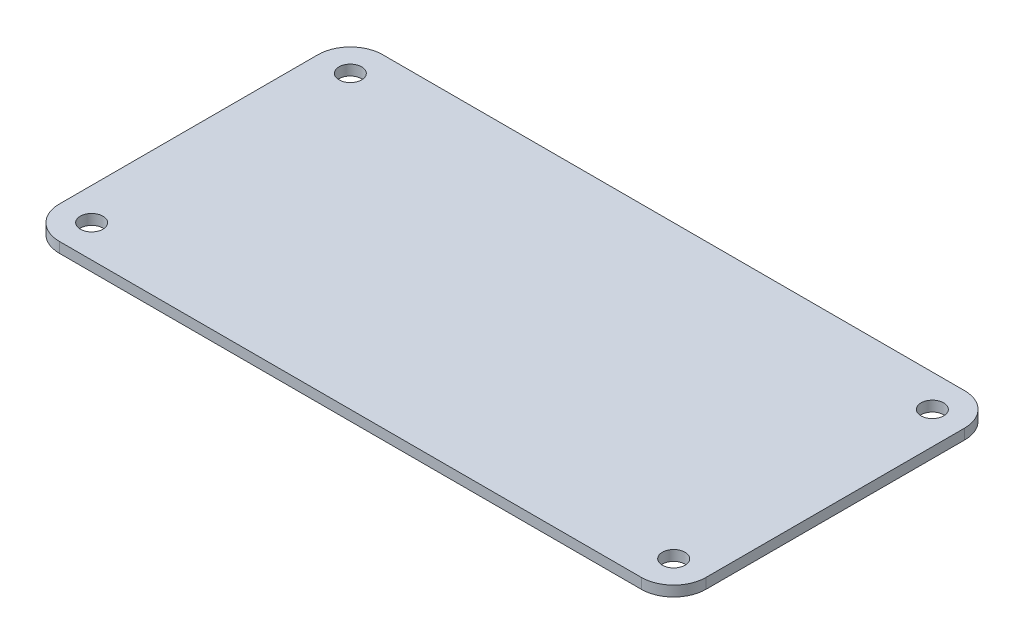
ISO-10303-21;
HEADER;
FILE_DESCRIPTION(('STEP AP214'),'2;1');
FILE_NAME('part.step','',(''),(''),'','','');
FILE_SCHEMA(('AUTOMOTIVE_DESIGN { 1 0 10303 214 1 1 1 1 }'));
ENDSEC;
DATA;
#1=APPLICATION_CONTEXT('core data for automotive mechanical design processes');
#2=APPLICATION_PROTOCOL_DEFINITION('international standard','automotive_design',2000,#1);
#3=PRODUCT_CONTEXT('',#1,'mechanical');
#4=PRODUCT('Part','Part','',(#3));
#5=PRODUCT_RELATED_PRODUCT_CATEGORY('part','',(#4));
#6=PRODUCT_DEFINITION_FORMATION('','',#4);
#7=PRODUCT_DEFINITION_CONTEXT('part definition',#1,'design');
#8=PRODUCT_DEFINITION('design','',#6,#7);
#9=PRODUCT_DEFINITION_SHAPE('','',#8);
#10=(LENGTH_UNIT() NAMED_UNIT(*) SI_UNIT(.MILLI.,.METRE.));
#11=(NAMED_UNIT(*) PLANE_ANGLE_UNIT() SI_UNIT($,.RADIAN.));
#12=(NAMED_UNIT(*) SI_UNIT($,.STERADIAN.) SOLID_ANGLE_UNIT());
#13=UNCERTAINTY_MEASURE_WITH_UNIT(LENGTH_MEASURE(1.E-05),#10,'distance_accuracy_value','');
#14=(GEOMETRIC_REPRESENTATION_CONTEXT(3) GLOBAL_UNCERTAINTY_ASSIGNED_CONTEXT((#13)) GLOBAL_UNIT_ASSIGNED_CONTEXT((#10,
#11,#12)) REPRESENTATION_CONTEXT('',''));
#15=CARTESIAN_POINT('',(0.,0.,0.));
#16=DIRECTION('',(0.,0.,1.));
#17=DIRECTION('',(1.,0.,0.));
#18=AXIS2_PLACEMENT_3D('',#15,#16,#17);
#19=CARTESIAN_POINT('',(0.,1.6,0.));
#20=DIRECTION('',(0.,1.,0.));
#21=DIRECTION('',(0.,0.,1.));
#22=AXIS2_PLACEMENT_3D('',#19,#20,#21);
#23=PLANE('',#22);
#24=CARTESIAN_POINT('',(45.0000000000004,1.6,20.));
#25=DIRECTION('',(0.,1.,0.));
#26=DIRECTION('',(0.,0.,1.));
#27=AXIS2_PLACEMENT_3D('',#24,#25,#26);
#28=CIRCLE('',#27,1.75);
#29=CARTESIAN_POINT('',(45.0000000000004,1.6,21.75));
#30=VERTEX_POINT('',#29);
#31=EDGE_CURVE('E183',#30,#30,#28,.T.);
#32=ORIENTED_EDGE('',*,*,#31,.F.);
#33=EDGE_LOOP('',(#32));
#34=FACE_BOUND('',#33,.T.);
#35=CARTESIAN_POINT('',(-45.,1.6,-20.));
#36=DIRECTION('',(0.,1.,0.));
#37=DIRECTION('',(0.,0.,1.));
#38=AXIS2_PLACEMENT_3D('',#35,#36,#37);
#39=CIRCLE('',#38,1.75);
#40=CARTESIAN_POINT('',(-45.,1.6,-18.25));
#41=VERTEX_POINT('',#40);
#42=EDGE_CURVE('E166',#41,#41,#39,.T.);
#43=ORIENTED_EDGE('',*,*,#42,.F.);
#44=EDGE_LOOP('',(#43));
#45=FACE_BOUND('',#44,.T.);
#46=DIRECTION('',(0.,0.,1.));
#47=VECTOR('',#46,1.);
#48=CARTESIAN_POINT('',(-50.,1.6,-25.));
#49=LINE('',#48,#47);
#50=CARTESIAN_POINT('',(-50.,1.6,-20.));
#51=VERTEX_POINT('',#50);
#52=CARTESIAN_POINT('',(-50.,1.6,20.));
#53=VERTEX_POINT('',#52);
#54=EDGE_CURVE('E173',#51,#53,#49,.T.);
#55=ORIENTED_EDGE('',*,*,#54,.T.);
#56=CARTESIAN_POINT('',(-45.,1.6,20.));
#57=DIRECTION('',(0.,1.,0.));
#58=DIRECTION('',(0.,0.,1.));
#59=AXIS2_PLACEMENT_3D('',#56,#57,#58);
#60=CIRCLE('',#59,5.);
#61=CARTESIAN_POINT('',(-45.,1.6,25.));
#62=VERTEX_POINT('',#61);
#63=EDGE_CURVE('E150',#53,#62,#60,.T.);
#64=ORIENTED_EDGE('',*,*,#63,.T.);
#65=DIRECTION('',(1.,0.,0.));
#66=VECTOR('',#65,1.);
#67=CARTESIAN_POINT('',(-50.,1.6,25.));
#68=LINE('',#67,#66);
#69=CARTESIAN_POINT('',(45.,1.6,25.));
#70=VERTEX_POINT('',#69);
#71=EDGE_CURVE('E121',#62,#70,#68,.T.);
#72=ORIENTED_EDGE('',*,*,#71,.T.);
#73=CARTESIAN_POINT('',(45.,1.6,20.));
#74=DIRECTION('',(0.,1.,0.));
#75=DIRECTION('',(0.,0.,1.));
#76=AXIS2_PLACEMENT_3D('',#73,#74,#75);
#77=CIRCLE('',#76,5.);
#78=CARTESIAN_POINT('',(50.,1.6,20.));
#79=VERTEX_POINT('',#78);
#80=EDGE_CURVE('E148',#70,#79,#77,.T.);
#81=ORIENTED_EDGE('',*,*,#80,.T.);
#82=DIRECTION('',(0.,0.,-1.));
#83=VECTOR('',#82,1.);
#84=CARTESIAN_POINT('',(50.,1.6,-25.));
#85=LINE('',#84,#83);
#86=CARTESIAN_POINT('',(50.,1.6,-20.));
#87=VERTEX_POINT('',#86);
#88=EDGE_CURVE('E128',#79,#87,#85,.T.);
#89=ORIENTED_EDGE('',*,*,#88,.T.);
#90=CARTESIAN_POINT('',(45.,1.6,-20.));
#91=DIRECTION('',(0.,1.,0.));
#92=DIRECTION('',(0.,0.,1.));
#93=AXIS2_PLACEMENT_3D('',#90,#91,#92);
#94=CIRCLE('',#93,5.);
#95=CARTESIAN_POINT('',(45.,1.6,-25.));
#96=VERTEX_POINT('',#95);
#97=EDGE_CURVE('E56',#87,#96,#94,.T.);
#98=ORIENTED_EDGE('',*,*,#97,.T.);
#99=DIRECTION('',(-1.,0.,0.));
#100=VECTOR('',#99,1.);
#101=CARTESIAN_POINT('',(-50.,1.6,-25.));
#102=LINE('',#101,#100);
#103=CARTESIAN_POINT('',(-45.,1.6,-25.));
#104=VERTEX_POINT('',#103);
#105=EDGE_CURVE('E131',#96,#104,#102,.T.);
#106=ORIENTED_EDGE('',*,*,#105,.T.);
#107=CARTESIAN_POINT('',(-45.,1.6,-20.));
#108=DIRECTION('',(0.,1.,0.));
#109=DIRECTION('',(0.,0.,1.));
#110=AXIS2_PLACEMENT_3D('',#107,#108,#109);
#111=CIRCLE('',#110,5.);
#112=EDGE_CURVE('E145',#104,#51,#111,.T.);
#113=ORIENTED_EDGE('',*,*,#112,.T.);
#114=EDGE_LOOP('',(#55,#64,#72,#81,#89,#98,#106,#113));
#115=FACE_BOUND('',#114,.T.);
#116=CARTESIAN_POINT('',(45.,1.6,-20.));
#117=DIRECTION('',(0.,1.,0.));
#118=DIRECTION('',(0.,0.,1.));
#119=AXIS2_PLACEMENT_3D('',#116,#117,#118);
#120=CIRCLE('',#119,1.75);
#121=CARTESIAN_POINT('',(45.,1.6,-18.25));
#122=VERTEX_POINT('',#121);
#123=EDGE_CURVE('E178',#122,#122,#120,.T.);
#124=ORIENTED_EDGE('',*,*,#123,.F.);
#125=EDGE_LOOP('',(#124));
#126=FACE_BOUND('',#125,.T.);
#127=CARTESIAN_POINT('',(-44.9999999999996,1.6,20.));
#128=DIRECTION('',(0.,1.,0.));
#129=DIRECTION('',(0.,0.,1.));
#130=AXIS2_PLACEMENT_3D('',#127,#128,#129);
#131=CIRCLE('',#130,1.75);
#132=CARTESIAN_POINT('',(-44.9999999999996,1.6,21.75));
#133=VERTEX_POINT('',#132);
#134=EDGE_CURVE('E189',#133,#133,#131,.T.);
#135=ORIENTED_EDGE('',*,*,#134,.F.);
#136=EDGE_LOOP('',(#135));
#137=FACE_BOUND('',#136,.T.);
#138=ADVANCED_FACE('F35',(#34,#45,#115,#126,#137),#23,.T.);
#139=CARTESIAN_POINT('',(0.,0.,0.));
#140=DIRECTION('',(0.,1.,0.));
#141=DIRECTION('',(0.,0.,1.));
#142=AXIS2_PLACEMENT_3D('',#139,#140,#141);
#143=PLANE('',#142);
#144=DIRECTION('',(1.,0.,0.));
#145=VECTOR('',#144,1.);
#146=CARTESIAN_POINT('',(-50.,0.,25.));
#147=LINE('',#146,#145);
#148=CARTESIAN_POINT('',(-45.,0.,25.));
#149=VERTEX_POINT('',#148);
#150=CARTESIAN_POINT('',(45.,0.,25.));
#151=VERTEX_POINT('',#150);
#152=EDGE_CURVE('E118',#149,#151,#147,.T.);
#153=ORIENTED_EDGE('',*,*,#152,.F.);
#154=CARTESIAN_POINT('',(-45.,0.,20.));
#155=DIRECTION('',(0.,1.,0.));
#156=DIRECTION('',(0.,0.,1.));
#157=AXIS2_PLACEMENT_3D('',#154,#155,#156);
#158=CIRCLE('',#157,5.);
#159=CARTESIAN_POINT('',(-50.,0.,20.));
#160=VERTEX_POINT('',#159);
#161=EDGE_CURVE('E101',#149,#160,#158,.F.);
#162=ORIENTED_EDGE('',*,*,#161,.T.);
#163=DIRECTION('',(0.,0.,1.));
#164=VECTOR('',#163,1.);
#165=CARTESIAN_POINT('',(-50.,0.,-25.));
#166=LINE('',#165,#164);
#167=CARTESIAN_POINT('',(-50.,0.,-20.));
#168=VERTEX_POINT('',#167);
#169=EDGE_CURVE('E129',#168,#160,#166,.T.);
#170=ORIENTED_EDGE('',*,*,#169,.F.);
#171=CARTESIAN_POINT('',(-45.,0.,-20.));
#172=DIRECTION('',(0.,1.,0.));
#173=DIRECTION('',(0.,0.,1.));
#174=AXIS2_PLACEMENT_3D('',#171,#172,#173);
#175=CIRCLE('',#174,5.);
#176=CARTESIAN_POINT('',(-45.,0.,-25.));
#177=VERTEX_POINT('',#176);
#178=EDGE_CURVE('E122',#168,#177,#175,.F.);
#179=ORIENTED_EDGE('',*,*,#178,.T.);
#180=DIRECTION('',(-1.,0.,0.));
#181=VECTOR('',#180,1.);
#182=CARTESIAN_POINT('',(-50.,0.,-25.));
#183=LINE('',#182,#181);
#184=CARTESIAN_POINT('',(45.,0.,-25.));
#185=VERTEX_POINT('',#184);
#186=EDGE_CURVE('E133',#185,#177,#183,.T.);
#187=ORIENTED_EDGE('',*,*,#186,.F.);
#188=CARTESIAN_POINT('',(45.,0.,-20.));
#189=DIRECTION('',(0.,1.,0.));
#190=DIRECTION('',(0.,0.,1.));
#191=AXIS2_PLACEMENT_3D('',#188,#189,#190);
#192=CIRCLE('',#191,5.);
#193=CARTESIAN_POINT('',(50.,0.,-20.));
#194=VERTEX_POINT('',#193);
#195=EDGE_CURVE('E139',#185,#194,#192,.F.);
#196=ORIENTED_EDGE('',*,*,#195,.T.);
#197=DIRECTION('',(0.,0.,-1.));
#198=VECTOR('',#197,1.);
#199=CARTESIAN_POINT('',(50.,0.,-25.));
#200=LINE('',#199,#198);
#201=CARTESIAN_POINT('',(50.,0.,20.));
#202=VERTEX_POINT('',#201);
#203=EDGE_CURVE('E161',#202,#194,#200,.T.);
#204=ORIENTED_EDGE('',*,*,#203,.F.);
#205=CARTESIAN_POINT('',(45.,0.,20.));
#206=DIRECTION('',(0.,1.,0.));
#207=DIRECTION('',(0.,0.,1.));
#208=AXIS2_PLACEMENT_3D('',#205,#206,#207);
#209=CIRCLE('',#208,5.);
#210=EDGE_CURVE('E112',#202,#151,#209,.F.);
#211=ORIENTED_EDGE('',*,*,#210,.T.);
#212=EDGE_LOOP('',(#153,#162,#170,#179,#187,#196,#204,#211));
#213=FACE_BOUND('',#212,.T.);
#214=CARTESIAN_POINT('',(-45.,0.,-20.));
#215=DIRECTION('',(0.,1.,0.));
#216=DIRECTION('',(0.,0.,1.));
#217=AXIS2_PLACEMENT_3D('',#214,#215,#216);
#218=CIRCLE('',#217,1.75);
#219=CARTESIAN_POINT('',(-45.,0.,-18.25));
#220=VERTEX_POINT('',#219);
#221=EDGE_CURVE('E169',#220,#220,#218,.T.);
#222=ORIENTED_EDGE('',*,*,#221,.T.);
#223=EDGE_LOOP('',(#222));
#224=FACE_BOUND('',#223,.T.);
#225=CARTESIAN_POINT('',(45.,0.,-20.));
#226=DIRECTION('',(0.,1.,0.));
#227=DIRECTION('',(0.,0.,1.));
#228=AXIS2_PLACEMENT_3D('',#225,#226,#227);
#229=CIRCLE('',#228,1.75);
#230=CARTESIAN_POINT('',(45.,0.,-18.25));
#231=VERTEX_POINT('',#230);
#232=EDGE_CURVE('E180',#231,#231,#229,.T.);
#233=ORIENTED_EDGE('',*,*,#232,.T.);
#234=EDGE_LOOP('',(#233));
#235=FACE_BOUND('',#234,.T.);
#236=CARTESIAN_POINT('',(45.0000000000004,0.,20.));
#237=DIRECTION('',(0.,1.,0.));
#238=DIRECTION('',(0.,0.,1.));
#239=AXIS2_PLACEMENT_3D('',#236,#237,#238);
#240=CIRCLE('',#239,1.75);
#241=CARTESIAN_POINT('',(45.0000000000004,0.,21.75));
#242=VERTEX_POINT('',#241);
#243=EDGE_CURVE('E186',#242,#242,#240,.T.);
#244=ORIENTED_EDGE('',*,*,#243,.T.);
#245=EDGE_LOOP('',(#244));
#246=FACE_BOUND('',#245,.T.);
#247=CARTESIAN_POINT('',(-44.9999999999996,0.,20.));
#248=DIRECTION('',(0.,1.,0.));
#249=DIRECTION('',(0.,0.,1.));
#250=AXIS2_PLACEMENT_3D('',#247,#248,#249);
#251=CIRCLE('',#250,1.75);
#252=CARTESIAN_POINT('',(-44.9999999999996,0.,21.75));
#253=VERTEX_POINT('',#252);
#254=EDGE_CURVE('E192',#253,#253,#251,.T.);
#255=ORIENTED_EDGE('',*,*,#254,.T.);
#256=EDGE_LOOP('',(#255));
#257=FACE_BOUND('',#256,.T.);
#258=ADVANCED_FACE('F125',(#213,#224,#235,#246,#257),#143,.F.);
#259=CARTESIAN_POINT('',(50.,1.6,-25.));
#260=DIRECTION('',(-1.,0.,0.));
#261=DIRECTION('',(0.,0.,1.));
#262=AXIS2_PLACEMENT_3D('',#259,#260,#261);
#263=PLANE('',#262);
#264=ORIENTED_EDGE('',*,*,#88,.F.);
#265=DIRECTION('',(0.,-1.,0.));
#266=VECTOR('',#265,1.);
#267=CARTESIAN_POINT('',(50.,1.6,20.));
#268=LINE('',#267,#266);
#269=EDGE_CURVE('E154',#79,#202,#268,.T.);
#270=ORIENTED_EDGE('',*,*,#269,.T.);
#271=ORIENTED_EDGE('',*,*,#203,.T.);
#272=DIRECTION('',(0.,-1.,0.));
#273=VECTOR('',#272,1.);
#274=CARTESIAN_POINT('',(50.,1.6,-20.));
#275=LINE('',#274,#273);
#276=EDGE_CURVE('E152',#194,#87,#275,.F.);
#277=ORIENTED_EDGE('',*,*,#276,.T.);
#278=EDGE_LOOP('',(#264,#270,#271,#277));
#279=FACE_BOUND('',#278,.T.);
#280=ADVANCED_FACE('F160',(#279),#263,.F.);
#281=CARTESIAN_POINT('',(-50.,1.6,-25.));
#282=DIRECTION('',(0.,0.,1.));
#283=DIRECTION('',(1.,0.,0.));
#284=AXIS2_PLACEMENT_3D('',#281,#282,#283);
#285=PLANE('',#284);
#286=ORIENTED_EDGE('',*,*,#105,.F.);
#287=DIRECTION('',(0.,-1.,0.));
#288=VECTOR('',#287,1.);
#289=CARTESIAN_POINT('',(45.,1.6,-25.));
#290=LINE('',#289,#288);
#291=EDGE_CURVE('E11',#96,#185,#290,.T.);
#292=ORIENTED_EDGE('',*,*,#291,.T.);
#293=ORIENTED_EDGE('',*,*,#186,.T.);
#294=DIRECTION('',(0.,-1.,0.));
#295=VECTOR('',#294,1.);
#296=CARTESIAN_POINT('',(-45.,1.6,-25.));
#297=LINE('',#296,#295);
#298=EDGE_CURVE('E43',#177,#104,#297,.F.);
#299=ORIENTED_EDGE('',*,*,#298,.T.);
#300=EDGE_LOOP('',(#286,#292,#293,#299));
#301=FACE_BOUND('',#300,.T.);
#302=ADVANCED_FACE('F219',(#301),#285,.F.);
#303=CARTESIAN_POINT('',(-50.,1.6,-25.));
#304=DIRECTION('',(1.,0.,0.));
#305=DIRECTION('',(0.,0.,-1.));
#306=AXIS2_PLACEMENT_3D('',#303,#304,#305);
#307=PLANE('',#306);
#308=ORIENTED_EDGE('',*,*,#169,.T.);
#309=DIRECTION('',(0.,-1.,0.));
#310=VECTOR('',#309,1.);
#311=CARTESIAN_POINT('',(-50.,1.6,20.));
#312=LINE('',#311,#310);
#313=EDGE_CURVE('E106',#160,#53,#312,.F.);
#314=ORIENTED_EDGE('',*,*,#313,.T.);
#315=ORIENTED_EDGE('',*,*,#54,.F.);
#316=DIRECTION('',(0.,-1.,0.));
#317=VECTOR('',#316,1.);
#318=CARTESIAN_POINT('',(-50.,1.6,-20.));
#319=LINE('',#318,#317);
#320=EDGE_CURVE('E111',#51,#168,#319,.T.);
#321=ORIENTED_EDGE('',*,*,#320,.T.);
#322=EDGE_LOOP('',(#308,#314,#315,#321));
#323=FACE_BOUND('',#322,.T.);
#324=ADVANCED_FACE('F216',(#323),#307,.F.);
#325=CARTESIAN_POINT('',(-50.,1.6,25.));
#326=DIRECTION('',(0.,0.,-1.));
#327=DIRECTION('',(-1.,0.,0.));
#328=AXIS2_PLACEMENT_3D('',#325,#326,#327);
#329=PLANE('',#328);
#330=ORIENTED_EDGE('',*,*,#71,.F.);
#331=DIRECTION('',(0.,-1.,0.));
#332=VECTOR('',#331,1.);
#333=CARTESIAN_POINT('',(-45.,1.6,25.));
#334=LINE('',#333,#332);
#335=EDGE_CURVE('E105',#62,#149,#334,.T.);
#336=ORIENTED_EDGE('',*,*,#335,.T.);
#337=ORIENTED_EDGE('',*,*,#152,.T.);
#338=DIRECTION('',(0.,-1.,0.));
#339=VECTOR('',#338,1.);
#340=CARTESIAN_POINT('',(45.,1.6,25.));
#341=LINE('',#340,#339);
#342=EDGE_CURVE('E123',#151,#70,#341,.F.);
#343=ORIENTED_EDGE('',*,*,#342,.T.);
#344=EDGE_LOOP('',(#330,#336,#337,#343));
#345=FACE_BOUND('',#344,.T.);
#346=ADVANCED_FACE('F117',(#345),#329,.F.);
#347=CARTESIAN_POINT('',(-45.,1.6,-20.));
#348=DIRECTION('',(0.,-1.,0.));
#349=DIRECTION('',(0.,0.,-1.));
#350=AXIS2_PLACEMENT_3D('',#347,#348,#349);
#351=CYLINDRICAL_SURFACE('',#350,1.75);
#352=ORIENTED_EDGE('',*,*,#42,.T.);
#353=EDGE_LOOP('',(#352));
#354=FACE_BOUND('',#353,.T.);
#355=ORIENTED_EDGE('',*,*,#221,.F.);
#356=EDGE_LOOP('',(#355));
#357=FACE_BOUND('',#356,.T.);
#358=ADVANCED_FACE('F211',(#354,#357),#351,.F.);
#359=CARTESIAN_POINT('',(45.,1.6,-20.));
#360=DIRECTION('',(0.,-1.,0.));
#361=DIRECTION('',(0.,0.,-1.));
#362=AXIS2_PLACEMENT_3D('',#359,#360,#361);
#363=CYLINDRICAL_SURFACE('',#362,1.75);
#364=ORIENTED_EDGE('',*,*,#123,.T.);
#365=EDGE_LOOP('',(#364));
#366=FACE_BOUND('',#365,.T.);
#367=ORIENTED_EDGE('',*,*,#232,.F.);
#368=EDGE_LOOP('',(#367));
#369=FACE_BOUND('',#368,.T.);
#370=ADVANCED_FACE('F243',(#366,#369),#363,.F.);
#371=CARTESIAN_POINT('',(45.0000000000004,1.6,20.));
#372=DIRECTION('',(0.,-1.,0.));
#373=DIRECTION('',(0.,0.,-1.));
#374=AXIS2_PLACEMENT_3D('',#371,#372,#373);
#375=CYLINDRICAL_SURFACE('',#374,1.75);
#376=ORIENTED_EDGE('',*,*,#31,.T.);
#377=EDGE_LOOP('',(#376));
#378=FACE_BOUND('',#377,.T.);
#379=ORIENTED_EDGE('',*,*,#243,.F.);
#380=EDGE_LOOP('',(#379));
#381=FACE_BOUND('',#380,.T.);
#382=ADVANCED_FACE('F246',(#378,#381),#375,.F.);
#383=CARTESIAN_POINT('',(-44.9999999999996,1.6,20.));
#384=DIRECTION('',(0.,-1.,0.));
#385=DIRECTION('',(0.,0.,-1.));
#386=AXIS2_PLACEMENT_3D('',#383,#384,#385);
#387=CYLINDRICAL_SURFACE('',#386,1.75);
#388=ORIENTED_EDGE('',*,*,#134,.T.);
#389=EDGE_LOOP('',(#388));
#390=FACE_BOUND('',#389,.T.);
#391=ORIENTED_EDGE('',*,*,#254,.F.);
#392=EDGE_LOOP('',(#391));
#393=FACE_BOUND('',#392,.T.);
#394=ADVANCED_FACE('F198',(#390,#393),#387,.F.);
#395=CARTESIAN_POINT('',(-45.,1.6,20.));
#396=DIRECTION('',(0.,-1.,0.));
#397=DIRECTION('',(0.,0.,-1.));
#398=AXIS2_PLACEMENT_3D('',#395,#396,#397);
#399=CYLINDRICAL_SURFACE('',#398,5.);
#400=ORIENTED_EDGE('',*,*,#63,.F.);
#401=ORIENTED_EDGE('',*,*,#313,.F.);
#402=ORIENTED_EDGE('',*,*,#161,.F.);
#403=ORIENTED_EDGE('',*,*,#335,.F.);
#404=EDGE_LOOP('',(#400,#401,#402,#403));
#405=FACE_BOUND('',#404,.T.);
#406=ADVANCED_FACE('F104',(#405),#399,.T.);
#407=CARTESIAN_POINT('',(45.,1.6,20.));
#408=DIRECTION('',(0.,-1.,0.));
#409=DIRECTION('',(0.,0.,-1.));
#410=AXIS2_PLACEMENT_3D('',#407,#408,#409);
#411=CYLINDRICAL_SURFACE('',#410,5.);
#412=ORIENTED_EDGE('',*,*,#80,.F.);
#413=ORIENTED_EDGE('',*,*,#342,.F.);
#414=ORIENTED_EDGE('',*,*,#210,.F.);
#415=ORIENTED_EDGE('',*,*,#269,.F.);
#416=EDGE_LOOP('',(#412,#413,#414,#415));
#417=FACE_BOUND('',#416,.T.);
#418=ADVANCED_FACE('F227',(#417),#411,.T.);
#419=CARTESIAN_POINT('',(45.,1.6,-20.));
#420=DIRECTION('',(0.,-1.,0.));
#421=DIRECTION('',(0.,0.,-1.));
#422=AXIS2_PLACEMENT_3D('',#419,#420,#421);
#423=CYLINDRICAL_SURFACE('',#422,5.);
#424=ORIENTED_EDGE('',*,*,#97,.F.);
#425=ORIENTED_EDGE('',*,*,#276,.F.);
#426=ORIENTED_EDGE('',*,*,#195,.F.);
#427=ORIENTED_EDGE('',*,*,#291,.F.);
#428=EDGE_LOOP('',(#424,#425,#426,#427));
#429=FACE_BOUND('',#428,.T.);
#430=ADVANCED_FACE('F229',(#429),#423,.T.);
#431=CARTESIAN_POINT('',(-45.,1.6,-20.));
#432=DIRECTION('',(0.,-1.,0.));
#433=DIRECTION('',(0.,0.,-1.));
#434=AXIS2_PLACEMENT_3D('',#431,#432,#433);
#435=CYLINDRICAL_SURFACE('',#434,5.);
#436=ORIENTED_EDGE('',*,*,#112,.F.);
#437=ORIENTED_EDGE('',*,*,#298,.F.);
#438=ORIENTED_EDGE('',*,*,#178,.F.);
#439=ORIENTED_EDGE('',*,*,#320,.F.);
#440=EDGE_LOOP('',(#436,#437,#438,#439));
#441=FACE_BOUND('',#440,.T.);
#442=ADVANCED_FACE('F37',(#441),#435,.T.);
#443=CLOSED_SHELL('',(#138,#258,#280,#302,#324,#346,#358,#370,#382,#394,#406,#418,#430,#442));
#444=MANIFOLD_SOLID_BREP('B2',#443);
#445=ADVANCED_BREP_SHAPE_REPRESENTATION('',(#18,#444),#14);
#446=SHAPE_DEFINITION_REPRESENTATION(#9,#445);
ENDSEC;
END-ISO-10303-21;
